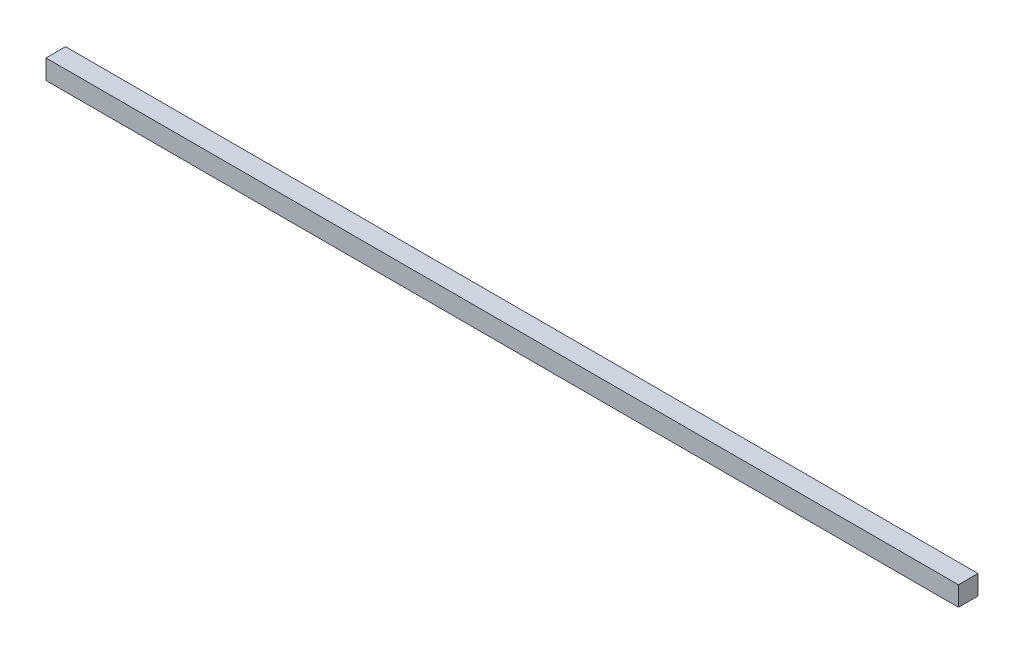
ISO-10303-21;
HEADER;
FILE_DESCRIPTION(('STEP AP214'),'2;1');
FILE_NAME('part.step','',(''),(''),'','','');
FILE_SCHEMA(('AUTOMOTIVE_DESIGN { 1 0 10303 214 1 1 1 1 }'));
ENDSEC;
DATA;
#1=APPLICATION_CONTEXT('core data for automotive mechanical design processes');
#2=APPLICATION_PROTOCOL_DEFINITION('international standard','automotive_design',2000,#1);
#3=PRODUCT_CONTEXT('',#1,'mechanical');
#4=PRODUCT('Part','Part','',(#3));
#5=PRODUCT_RELATED_PRODUCT_CATEGORY('part','',(#4));
#6=PRODUCT_DEFINITION_FORMATION('','',#4);
#7=PRODUCT_DEFINITION_CONTEXT('part definition',#1,'design');
#8=PRODUCT_DEFINITION('design','',#6,#7);
#9=PRODUCT_DEFINITION_SHAPE('','',#8);
#10=(LENGTH_UNIT() NAMED_UNIT(*) SI_UNIT(.MILLI.,.METRE.));
#11=(NAMED_UNIT(*) PLANE_ANGLE_UNIT() SI_UNIT($,.RADIAN.));
#12=(NAMED_UNIT(*) SI_UNIT($,.STERADIAN.) SOLID_ANGLE_UNIT());
#13=UNCERTAINTY_MEASURE_WITH_UNIT(LENGTH_MEASURE(1.E-05),#10,'distance_accuracy_value','');
#14=(GEOMETRIC_REPRESENTATION_CONTEXT(3) GLOBAL_UNCERTAINTY_ASSIGNED_CONTEXT((#13)) GLOBAL_UNIT_ASSIGNED_CONTEXT((#10,
#11,#12)) REPRESENTATION_CONTEXT('',''));
#15=CARTESIAN_POINT('',(0.,0.,0.));
#16=DIRECTION('',(0.,0.,1.));
#17=DIRECTION('',(1.,0.,0.));
#18=AXIS2_PLACEMENT_3D('',#15,#16,#17);
#19=CARTESIAN_POINT('',(0.,0.,88.9));
#20=DIRECTION('',(1.,0.,0.));
#21=DIRECTION('',(0.,0.,-1.));
#22=AXIS2_PLACEMENT_3D('',#19,#20,#21);
#23=PLANE('',#22);
#24=DIRECTION('',(0.,-1.,0.));
#25=VECTOR('',#24,1.);
#26=CARTESIAN_POINT('',(0.,0.,0.));
#27=LINE('',#26,#25);
#28=CARTESIAN_POINT('',(0.,88.9,0.));
#29=VERTEX_POINT('',#28);
#30=CARTESIAN_POINT('',(0.,0.,0.));
#31=VERTEX_POINT('',#30);
#32=EDGE_CURVE('E107',#29,#31,#27,.T.);
#33=ORIENTED_EDGE('',*,*,#32,.T.);
#34=DIRECTION('',(0.,0.,-1.));
#35=VECTOR('',#34,1.);
#36=CARTESIAN_POINT('',(0.,0.,88.9));
#37=LINE('',#36,#35);
#38=CARTESIAN_POINT('',(0.,0.,88.9));
#39=VERTEX_POINT('',#38);
#40=EDGE_CURVE('E11',#39,#31,#37,.T.);
#41=ORIENTED_EDGE('',*,*,#40,.F.);
#42=DIRECTION('',(0.,-1.,0.));
#43=VECTOR('',#42,1.);
#44=CARTESIAN_POINT('',(0.,0.,88.9));
#45=LINE('',#44,#43);
#46=CARTESIAN_POINT('',(0.,88.9,88.9));
#47=VERTEX_POINT('',#46);
#48=EDGE_CURVE('E91',#47,#39,#45,.T.);
#49=ORIENTED_EDGE('',*,*,#48,.F.);
#50=DIRECTION('',(0.,0.,-1.));
#51=VECTOR('',#50,1.);
#52=CARTESIAN_POINT('',(0.,88.9,88.9));
#53=LINE('',#52,#51);
#54=EDGE_CURVE('E103',#47,#29,#53,.T.);
#55=ORIENTED_EDGE('',*,*,#54,.T.);
#56=EDGE_LOOP('',(#33,#41,#49,#55));
#57=FACE_BOUND('',#56,.T.);
#58=ADVANCED_FACE('F39',(#57),#23,.F.);
#59=CARTESIAN_POINT('',(0.,0.,88.9));
#60=DIRECTION('',(0.,1.,0.));
#61=DIRECTION('',(0.,0.,1.));
#62=AXIS2_PLACEMENT_3D('',#59,#60,#61);
#63=PLANE('',#62);
#64=DIRECTION('',(1.,0.,0.));
#65=VECTOR('',#64,1.);
#66=CARTESIAN_POINT('',(0.,0.,0.));
#67=LINE('',#66,#65);
#68=CARTESIAN_POINT('',(4150.,0.,0.));
#69=VERTEX_POINT('',#68);
#70=EDGE_CURVE('E96',#31,#69,#67,.T.);
#71=ORIENTED_EDGE('',*,*,#70,.T.);
#72=DIRECTION('',(0.,0.,-1.));
#73=VECTOR('',#72,1.);
#74=CARTESIAN_POINT('',(4150.,0.,88.9));
#75=LINE('',#74,#73);
#76=CARTESIAN_POINT('',(4150.,0.,88.9));
#77=VERTEX_POINT('',#76);
#78=EDGE_CURVE('E48',#77,#69,#75,.T.);
#79=ORIENTED_EDGE('',*,*,#78,.F.);
#80=DIRECTION('',(1.,0.,0.));
#81=VECTOR('',#80,1.);
#82=CARTESIAN_POINT('',(0.,0.,88.9));
#83=LINE('',#82,#81);
#84=EDGE_CURVE('E86',#39,#77,#83,.T.);
#85=ORIENTED_EDGE('',*,*,#84,.F.);
#86=ORIENTED_EDGE('',*,*,#40,.T.);
#87=EDGE_LOOP('',(#71,#79,#85,#86));
#88=FACE_BOUND('',#87,.T.);
#89=ADVANCED_FACE('F95',(#88),#63,.F.);
#90=CARTESIAN_POINT('',(4150.,0.,88.9));
#91=DIRECTION('',(-1.,0.,0.));
#92=DIRECTION('',(0.,0.,1.));
#93=AXIS2_PLACEMENT_3D('',#90,#91,#92);
#94=PLANE('',#93);
#95=DIRECTION('',(0.,1.,0.));
#96=VECTOR('',#95,1.);
#97=CARTESIAN_POINT('',(4150.,0.,0.));
#98=LINE('',#97,#96);
#99=CARTESIAN_POINT('',(4150.,88.9,0.));
#100=VERTEX_POINT('',#99);
#101=EDGE_CURVE('E73',#69,#100,#98,.T.);
#102=ORIENTED_EDGE('',*,*,#101,.T.);
#103=DIRECTION('',(0.,0.,-1.));
#104=VECTOR('',#103,1.);
#105=CARTESIAN_POINT('',(4150.,88.9,88.9));
#106=LINE('',#105,#104);
#107=CARTESIAN_POINT('',(4150.,88.9,88.9));
#108=VERTEX_POINT('',#107);
#109=EDGE_CURVE('E98',#108,#100,#106,.T.);
#110=ORIENTED_EDGE('',*,*,#109,.F.);
#111=DIRECTION('',(0.,1.,0.));
#112=VECTOR('',#111,1.);
#113=CARTESIAN_POINT('',(4150.,0.,88.9));
#114=LINE('',#113,#112);
#115=EDGE_CURVE('E89',#77,#108,#114,.T.);
#116=ORIENTED_EDGE('',*,*,#115,.F.);
#117=ORIENTED_EDGE('',*,*,#78,.T.);
#118=EDGE_LOOP('',(#102,#110,#116,#117));
#119=FACE_BOUND('',#118,.T.);
#120=ADVANCED_FACE('F99',(#119),#94,.F.);
#121=CARTESIAN_POINT('',(0.,88.9,88.9));
#122=DIRECTION('',(0.,-1.,0.));
#123=DIRECTION('',(0.,0.,-1.));
#124=AXIS2_PLACEMENT_3D('',#121,#122,#123);
#125=PLANE('',#124);
#126=DIRECTION('',(-1.,0.,0.));
#127=VECTOR('',#126,1.);
#128=CARTESIAN_POINT('',(0.,88.9,0.));
#129=LINE('',#128,#127);
#130=EDGE_CURVE('E79',#100,#29,#129,.T.);
#131=ORIENTED_EDGE('',*,*,#130,.T.);
#132=ORIENTED_EDGE('',*,*,#54,.F.);
#133=DIRECTION('',(-1.,0.,0.));
#134=VECTOR('',#133,1.);
#135=CARTESIAN_POINT('',(0.,88.9,88.9));
#136=LINE('',#135,#134);
#137=EDGE_CURVE('E56',#108,#47,#136,.T.);
#138=ORIENTED_EDGE('',*,*,#137,.F.);
#139=ORIENTED_EDGE('',*,*,#109,.T.);
#140=EDGE_LOOP('',(#131,#132,#138,#139));
#141=FACE_BOUND('',#140,.T.);
#142=ADVANCED_FACE('F120',(#141),#125,.F.);
#143=CARTESIAN_POINT('',(0.,0.,88.9));
#144=DIRECTION('',(0.,0.,-1.));
#145=DIRECTION('',(-1.,0.,0.));
#146=AXIS2_PLACEMENT_3D('',#143,#144,#145);
#147=PLANE('',#146);
#148=ORIENTED_EDGE('',*,*,#48,.T.);
#149=ORIENTED_EDGE('',*,*,#84,.T.);
#150=ORIENTED_EDGE('',*,*,#115,.T.);
#151=ORIENTED_EDGE('',*,*,#137,.T.);
#152=EDGE_LOOP('',(#148,#149,#150,#151));
#153=FACE_BOUND('',#152,.T.);
#154=ADVANCED_FACE('F87',(#153),#147,.F.);
#155=CARTESIAN_POINT('',(0.,0.,0.));
#156=DIRECTION('',(0.,0.,-1.));
#157=DIRECTION('',(-1.,0.,0.));
#158=AXIS2_PLACEMENT_3D('',#155,#156,#157);
#159=PLANE('',#158);
#160=ORIENTED_EDGE('',*,*,#32,.F.);
#161=ORIENTED_EDGE('',*,*,#130,.F.);
#162=ORIENTED_EDGE('',*,*,#101,.F.);
#163=ORIENTED_EDGE('',*,*,#70,.F.);
#164=EDGE_LOOP('',(#160,#161,#162,#163));
#165=FACE_BOUND('',#164,.T.);
#166=ADVANCED_FACE('F123',(#165),#159,.T.);
#167=CLOSED_SHELL('',(#58,#89,#120,#142,#154,#166));
#168=MANIFOLD_SOLID_BREP('B2',#167);
#169=ADVANCED_BREP_SHAPE_REPRESENTATION('',(#18,#168),#14);
#170=SHAPE_DEFINITION_REPRESENTATION(#9,#169);
ENDSEC;
END-ISO-10303-21;
